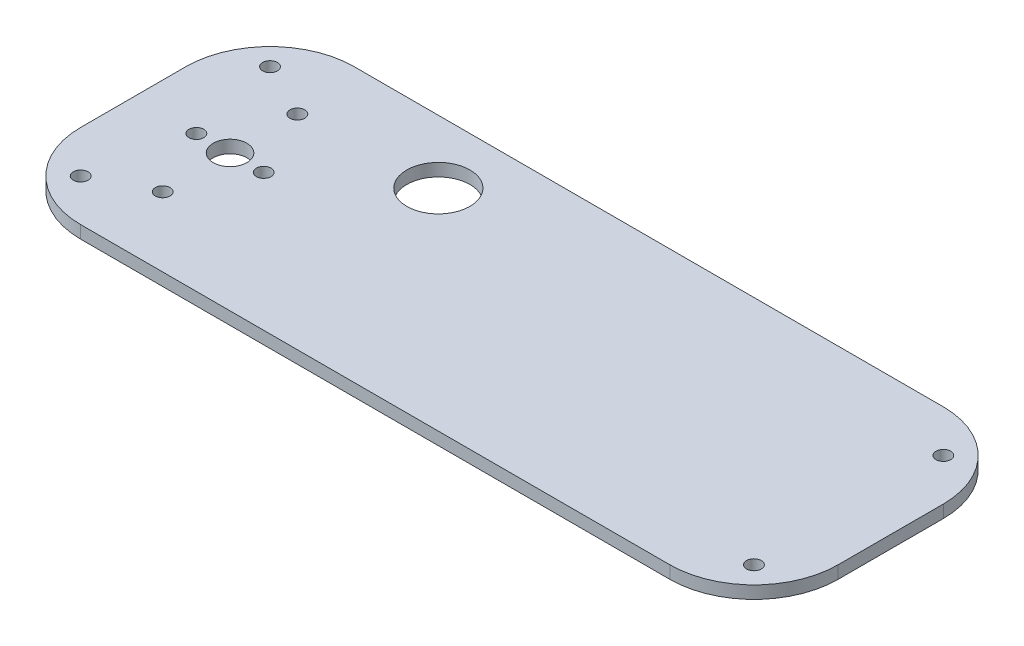
ISO-10303-21;
HEADER;
FILE_DESCRIPTION(('STEP AP214'),'2;1');
FILE_NAME('part.step','',(''),(''),'','','');
FILE_SCHEMA(('AUTOMOTIVE_DESIGN { 1 0 10303 214 1 1 1 1 }'));
ENDSEC;
DATA;
#1=APPLICATION_CONTEXT('core data for automotive mechanical design processes');
#2=APPLICATION_PROTOCOL_DEFINITION('international standard','automotive_design',2000,#1);
#3=PRODUCT_CONTEXT('',#1,'mechanical');
#4=PRODUCT('Part','Part','',(#3));
#5=PRODUCT_RELATED_PRODUCT_CATEGORY('part','',(#4));
#6=PRODUCT_DEFINITION_FORMATION('','',#4);
#7=PRODUCT_DEFINITION_CONTEXT('part definition',#1,'design');
#8=PRODUCT_DEFINITION('design','',#6,#7);
#9=PRODUCT_DEFINITION_SHAPE('','',#8);
#10=(LENGTH_UNIT() NAMED_UNIT(*) SI_UNIT(.MILLI.,.METRE.));
#11=(NAMED_UNIT(*) PLANE_ANGLE_UNIT() SI_UNIT($,.RADIAN.));
#12=(NAMED_UNIT(*) SI_UNIT($,.STERADIAN.) SOLID_ANGLE_UNIT());
#13=UNCERTAINTY_MEASURE_WITH_UNIT(LENGTH_MEASURE(1.E-05),#10,'distance_accuracy_value','');
#14=(GEOMETRIC_REPRESENTATION_CONTEXT(3) GLOBAL_UNCERTAINTY_ASSIGNED_CONTEXT((#13)) GLOBAL_UNIT_ASSIGNED_CONTEXT((#10,
#11,#12)) REPRESENTATION_CONTEXT('',''));
#15=CARTESIAN_POINT('',(0.,0.,0.));
#16=DIRECTION('',(0.,0.,1.));
#17=DIRECTION('',(1.,0.,0.));
#18=AXIS2_PLACEMENT_3D('',#15,#16,#17);
#19=CARTESIAN_POINT('',(90.,3.,32.5));
#20=DIRECTION('',(-1.,0.,0.));
#21=DIRECTION('',(0.,0.,1.));
#22=AXIS2_PLACEMENT_3D('',#19,#20,#21);
#23=PLANE('',#22);
#24=DIRECTION('',(0.,0.,-1.));
#25=VECTOR('',#24,1.);
#26=CARTESIAN_POINT('',(90.,0.,32.5));
#27=LINE('',#26,#25);
#28=CARTESIAN_POINT('',(90.,0.,12.5));
#29=VERTEX_POINT('',#28);
#30=CARTESIAN_POINT('',(90.,0.,-12.5));
#31=VERTEX_POINT('',#30);
#32=EDGE_CURVE('E187',#29,#31,#27,.T.);
#33=ORIENTED_EDGE('',*,*,#32,.T.);
#34=DIRECTION('',(0.,-1.,0.));
#35=VECTOR('',#34,1.);
#36=CARTESIAN_POINT('',(90.,3.,-12.5));
#37=LINE('',#36,#35);
#38=CARTESIAN_POINT('',(90.,3.,-12.5));
#39=VERTEX_POINT('',#38);
#40=EDGE_CURVE('E11',#31,#39,#37,.F.);
#41=ORIENTED_EDGE('',*,*,#40,.T.);
#42=DIRECTION('',(0.,0.,-1.));
#43=VECTOR('',#42,1.);
#44=CARTESIAN_POINT('',(90.,3.,32.5));
#45=LINE('',#44,#43);
#46=CARTESIAN_POINT('',(90.,3.,12.5));
#47=VERTEX_POINT('',#46);
#48=EDGE_CURVE('E140',#47,#39,#45,.T.);
#49=ORIENTED_EDGE('',*,*,#48,.F.);
#50=DIRECTION('',(0.,-1.,0.));
#51=VECTOR('',#50,1.);
#52=CARTESIAN_POINT('',(90.,3.,12.5));
#53=LINE('',#52,#51);
#54=EDGE_CURVE('E53',#47,#29,#53,.T.);
#55=ORIENTED_EDGE('',*,*,#54,.T.);
#56=EDGE_LOOP('',(#33,#41,#49,#55));
#57=FACE_BOUND('',#56,.T.);
#58=ADVANCED_FACE('F44',(#57),#23,.F.);
#59=CARTESIAN_POINT('',(-90.,3.,-32.5));
#60=DIRECTION('',(0.,0.,1.));
#61=DIRECTION('',(1.,0.,0.));
#62=AXIS2_PLACEMENT_3D('',#59,#60,#61);
#63=PLANE('',#62);
#64=DIRECTION('',(-1.,0.,0.));
#65=VECTOR('',#64,1.);
#66=CARTESIAN_POINT('',(-90.,0.,-32.5));
#67=LINE('',#66,#65);
#68=CARTESIAN_POINT('',(69.9999999999999,0.,-32.5));
#69=VERTEX_POINT('',#68);
#70=CARTESIAN_POINT('',(-70.,0.,-32.5));
#71=VERTEX_POINT('',#70);
#72=EDGE_CURVE('E147',#69,#71,#67,.T.);
#73=ORIENTED_EDGE('',*,*,#72,.T.);
#74=DIRECTION('',(0.,-1.,0.));
#75=VECTOR('',#74,1.);
#76=CARTESIAN_POINT('',(-70.,3.,-32.5));
#77=LINE('',#76,#75);
#78=CARTESIAN_POINT('',(-70.,3.,-32.5));
#79=VERTEX_POINT('',#78);
#80=EDGE_CURVE('E60',#71,#79,#77,.F.);
#81=ORIENTED_EDGE('',*,*,#80,.T.);
#82=DIRECTION('',(-1.,0.,0.));
#83=VECTOR('',#82,1.);
#84=CARTESIAN_POINT('',(-90.,3.,-32.5));
#85=LINE('',#84,#83);
#86=CARTESIAN_POINT('',(69.9999999999999,3.,-32.5));
#87=VERTEX_POINT('',#86);
#88=EDGE_CURVE('E145',#87,#79,#85,.T.);
#89=ORIENTED_EDGE('',*,*,#88,.F.);
#90=DIRECTION('',(0.,-1.,0.));
#91=VECTOR('',#90,1.);
#92=CARTESIAN_POINT('',(70.,3.,-32.5));
#93=LINE('',#92,#91);
#94=EDGE_CURVE('E176',#87,#69,#93,.T.);
#95=ORIENTED_EDGE('',*,*,#94,.T.);
#96=EDGE_LOOP('',(#73,#81,#89,#95));
#97=FACE_BOUND('',#96,.T.);
#98=ADVANCED_FACE('F327',(#97),#63,.F.);
#99=CARTESIAN_POINT('',(-90.,3.,32.5));
#100=DIRECTION('',(1.,0.,0.));
#101=DIRECTION('',(0.,0.,-1.));
#102=AXIS2_PLACEMENT_3D('',#99,#100,#101);
#103=PLANE('',#102);
#104=DIRECTION('',(0.,0.,1.));
#105=VECTOR('',#104,1.);
#106=CARTESIAN_POINT('',(-90.,0.,32.5));
#107=LINE('',#106,#105);
#108=CARTESIAN_POINT('',(-90.,0.,-12.5));
#109=VERTEX_POINT('',#108);
#110=CARTESIAN_POINT('',(-90.,0.,12.5));
#111=VERTEX_POINT('',#110);
#112=EDGE_CURVE('E141',#109,#111,#107,.T.);
#113=ORIENTED_EDGE('',*,*,#112,.T.);
#114=DIRECTION('',(0.,-1.,0.));
#115=VECTOR('',#114,1.);
#116=CARTESIAN_POINT('',(-90.,3.,12.5));
#117=LINE('',#116,#115);
#118=CARTESIAN_POINT('',(-90.,3.,12.5));
#119=VERTEX_POINT('',#118);
#120=EDGE_CURVE('E116',#111,#119,#117,.F.);
#121=ORIENTED_EDGE('',*,*,#120,.T.);
#122=DIRECTION('',(0.,0.,1.));
#123=VECTOR('',#122,1.);
#124=CARTESIAN_POINT('',(-90.,3.,32.5));
#125=LINE('',#124,#123);
#126=CARTESIAN_POINT('',(-90.,3.,-12.5));
#127=VERTEX_POINT('',#126);
#128=EDGE_CURVE('E203',#127,#119,#125,.T.);
#129=ORIENTED_EDGE('',*,*,#128,.F.);
#130=DIRECTION('',(0.,-1.,0.));
#131=VECTOR('',#130,1.);
#132=CARTESIAN_POINT('',(-90.,3.,-12.5));
#133=LINE('',#132,#131);
#134=EDGE_CURVE('E122',#127,#109,#133,.T.);
#135=ORIENTED_EDGE('',*,*,#134,.T.);
#136=EDGE_LOOP('',(#113,#121,#129,#135));
#137=FACE_BOUND('',#136,.T.);
#138=ADVANCED_FACE('F324',(#137),#103,.F.);
#139=CARTESIAN_POINT('',(-90.,3.,32.5));
#140=DIRECTION('',(0.,0.,-1.));
#141=DIRECTION('',(-1.,0.,0.));
#142=AXIS2_PLACEMENT_3D('',#139,#140,#141);
#143=PLANE('',#142);
#144=DIRECTION('',(1.,0.,0.));
#145=VECTOR('',#144,1.);
#146=CARTESIAN_POINT('',(-90.,3.,32.5));
#147=LINE('',#146,#145);
#148=CARTESIAN_POINT('',(-70.,3.,32.5));
#149=VERTEX_POINT('',#148);
#150=CARTESIAN_POINT('',(69.9999999999999,3.,32.5));
#151=VERTEX_POINT('',#150);
#152=EDGE_CURVE('E132',#149,#151,#147,.T.);
#153=ORIENTED_EDGE('',*,*,#152,.F.);
#154=DIRECTION('',(0.,-1.,0.));
#155=VECTOR('',#154,1.);
#156=CARTESIAN_POINT('',(-70.,3.,32.5));
#157=LINE('',#156,#155);
#158=CARTESIAN_POINT('',(-70.,0.,32.5));
#159=VERTEX_POINT('',#158);
#160=EDGE_CURVE('E115',#149,#159,#157,.T.);
#161=ORIENTED_EDGE('',*,*,#160,.T.);
#162=DIRECTION('',(1.,0.,0.));
#163=VECTOR('',#162,1.);
#164=CARTESIAN_POINT('',(-90.,0.,32.5));
#165=LINE('',#164,#163);
#166=CARTESIAN_POINT('',(69.9999999999999,0.,32.5));
#167=VERTEX_POINT('',#166);
#168=EDGE_CURVE('E129',#159,#167,#165,.T.);
#169=ORIENTED_EDGE('',*,*,#168,.T.);
#170=DIRECTION('',(0.,-1.,0.));
#171=VECTOR('',#170,1.);
#172=CARTESIAN_POINT('',(70.,3.,32.5));
#173=LINE('',#172,#171);
#174=EDGE_CURVE('E135',#167,#151,#173,.F.);
#175=ORIENTED_EDGE('',*,*,#174,.T.);
#176=EDGE_LOOP('',(#153,#161,#169,#175));
#177=FACE_BOUND('',#176,.T.);
#178=ADVANCED_FACE('F128',(#177),#143,.F.);
#179=CARTESIAN_POINT('',(0.,3.,0.));
#180=DIRECTION('',(0.,-1.,0.));
#181=DIRECTION('',(0.,0.,-1.));
#182=AXIS2_PLACEMENT_3D('',#179,#180,#181);
#183=PLANE('',#182);
#184=CARTESIAN_POINT('',(-35.,3.,-17.5));
#185=DIRECTION('',(0.,-1.,0.));
#186=DIRECTION('',(0.,0.,-1.));
#187=AXIS2_PLACEMENT_3D('',#184,#185,#186);
#188=CIRCLE('',#187,7.5);
#189=CARTESIAN_POINT('',(-35.,3.,-25.));
#190=VERTEX_POINT('',#189);
#191=EDGE_CURVE('E266',#190,#190,#188,.T.);
#192=ORIENTED_EDGE('',*,*,#191,.T.);
#193=EDGE_LOOP('',(#192));
#194=FACE_BOUND('',#193,.T.);
#195=CARTESIAN_POINT('',(-67.,3.,16.));
#196=DIRECTION('',(0.,-1.,0.));
#197=DIRECTION('',(0.,0.,-1.));
#198=AXIS2_PLACEMENT_3D('',#195,#196,#197);
#199=CIRCLE('',#198,1.75);
#200=CARTESIAN_POINT('',(-67.,3.,14.25));
#201=VERTEX_POINT('',#200);
#202=EDGE_CURVE('E241',#201,#201,#199,.T.);
#203=ORIENTED_EDGE('',*,*,#202,.T.);
#204=EDGE_LOOP('',(#203));
#205=FACE_BOUND('',#204,.T.);
#206=CARTESIAN_POINT('',(-67.,3.,-16.));
#207=DIRECTION('',(0.,-1.,0.));
#208=DIRECTION('',(0.,0.,-1.));
#209=AXIS2_PLACEMENT_3D('',#206,#207,#208);
#210=CIRCLE('',#209,1.75);
#211=CARTESIAN_POINT('',(-67.,3.,-17.75));
#212=VERTEX_POINT('',#211);
#213=EDGE_CURVE('E249',#212,#212,#210,.T.);
#214=ORIENTED_EDGE('',*,*,#213,.T.);
#215=EDGE_LOOP('',(#214));
#216=FACE_BOUND('',#215,.T.);
#217=CARTESIAN_POINT('',(-75.,3.,0.));
#218=DIRECTION('',(0.,-1.,0.));
#219=DIRECTION('',(0.,0.,-1.));
#220=AXIS2_PLACEMENT_3D('',#217,#218,#219);
#221=CIRCLE('',#220,1.75);
#222=CARTESIAN_POINT('',(-75.,3.,-1.75));
#223=VERTEX_POINT('',#222);
#224=EDGE_CURVE('E250',#223,#223,#221,.T.);
#225=ORIENTED_EDGE('',*,*,#224,.T.);
#226=EDGE_LOOP('',(#225));
#227=FACE_BOUND('',#226,.T.);
#228=CARTESIAN_POINT('',(-59.,3.,0.));
#229=DIRECTION('',(0.,-1.,0.));
#230=DIRECTION('',(0.,0.,-1.));
#231=AXIS2_PLACEMENT_3D('',#228,#229,#230);
#232=CIRCLE('',#231,1.75);
#233=CARTESIAN_POINT('',(-59.,3.,-1.75));
#234=VERTEX_POINT('',#233);
#235=EDGE_CURVE('E265',#234,#234,#232,.T.);
#236=ORIENTED_EDGE('',*,*,#235,.T.);
#237=EDGE_LOOP('',(#236));
#238=FACE_BOUND('',#237,.T.);
#239=CARTESIAN_POINT('',(-67.,3.,0.));
#240=DIRECTION('',(0.,-1.,0.));
#241=DIRECTION('',(0.,0.,-1.));
#242=AXIS2_PLACEMENT_3D('',#239,#240,#241);
#243=CIRCLE('',#242,4.00000000000001);
#244=CARTESIAN_POINT('',(-67.,3.,-4.00000000000001));
#245=VERTEX_POINT('',#244);
#246=EDGE_CURVE('E218',#245,#245,#243,.T.);
#247=ORIENTED_EDGE('',*,*,#246,.T.);
#248=EDGE_LOOP('',(#247));
#249=FACE_BOUND('',#248,.T.);
#250=CARTESIAN_POINT('',(80.,3.,-22.5));
#251=DIRECTION('',(0.,1.,0.));
#252=DIRECTION('',(0.,0.,1.));
#253=AXIS2_PLACEMENT_3D('',#250,#251,#252);
#254=CIRCLE('',#253,1.75);
#255=CARTESIAN_POINT('',(80.,3.,-20.75));
#256=VERTEX_POINT('',#255);
#257=EDGE_CURVE('E217',#256,#256,#254,.T.);
#258=ORIENTED_EDGE('',*,*,#257,.F.);
#259=EDGE_LOOP('',(#258));
#260=FACE_BOUND('',#259,.T.);
#261=CARTESIAN_POINT('',(80.,3.,22.5));
#262=DIRECTION('',(0.,1.,0.));
#263=DIRECTION('',(0.,0.,1.));
#264=AXIS2_PLACEMENT_3D('',#261,#262,#263);
#265=CIRCLE('',#264,1.75);
#266=CARTESIAN_POINT('',(80.,3.,24.25));
#267=VERTEX_POINT('',#266);
#268=EDGE_CURVE('E226',#267,#267,#265,.T.);
#269=ORIENTED_EDGE('',*,*,#268,.F.);
#270=EDGE_LOOP('',(#269));
#271=FACE_BOUND('',#270,.T.);
#272=CARTESIAN_POINT('',(-80.,3.,22.5));
#273=DIRECTION('',(0.,1.,0.));
#274=DIRECTION('',(0.,0.,1.));
#275=AXIS2_PLACEMENT_3D('',#272,#273,#274);
#276=CIRCLE('',#275,1.75);
#277=CARTESIAN_POINT('',(-80.,3.,24.25));
#278=VERTEX_POINT('',#277);
#279=EDGE_CURVE('E211',#278,#278,#276,.T.);
#280=ORIENTED_EDGE('',*,*,#279,.F.);
#281=EDGE_LOOP('',(#280));
#282=FACE_BOUND('',#281,.T.);
#283=CARTESIAN_POINT('',(-80.,3.,-22.5));
#284=DIRECTION('',(0.,1.,0.));
#285=DIRECTION('',(0.,0.,1.));
#286=AXIS2_PLACEMENT_3D('',#283,#284,#285);
#287=CIRCLE('',#286,1.75);
#288=CARTESIAN_POINT('',(-80.,3.,-20.75));
#289=VERTEX_POINT('',#288);
#290=EDGE_CURVE('E198',#289,#289,#287,.T.);
#291=ORIENTED_EDGE('',*,*,#290,.F.);
#292=EDGE_LOOP('',(#291));
#293=FACE_BOUND('',#292,.T.);
#294=ORIENTED_EDGE('',*,*,#128,.T.);
#295=CARTESIAN_POINT('',(-70.,3.,12.5));
#296=DIRECTION('',(0.,-1.,0.));
#297=DIRECTION('',(0.,0.,-1.));
#298=AXIS2_PLACEMENT_3D('',#295,#296,#297);
#299=CIRCLE('',#298,20.);
#300=EDGE_CURVE('E173',#119,#149,#299,.F.);
#301=ORIENTED_EDGE('',*,*,#300,.T.);
#302=ORIENTED_EDGE('',*,*,#152,.T.);
#303=CARTESIAN_POINT('',(70.,3.,12.5));
#304=DIRECTION('',(0.,-1.,0.));
#305=DIRECTION('',(0.,0.,-1.));
#306=AXIS2_PLACEMENT_3D('',#303,#304,#305);
#307=CIRCLE('',#306,20.);
#308=EDGE_CURVE('E165',#151,#47,#307,.F.);
#309=ORIENTED_EDGE('',*,*,#308,.T.);
#310=ORIENTED_EDGE('',*,*,#48,.T.);
#311=CARTESIAN_POINT('',(70.,3.,-12.5));
#312=DIRECTION('',(0.,-1.,0.));
#313=DIRECTION('',(0.,0.,-1.));
#314=AXIS2_PLACEMENT_3D('',#311,#312,#313);
#315=CIRCLE('',#314,20.);
#316=EDGE_CURVE('E67',#39,#87,#315,.F.);
#317=ORIENTED_EDGE('',*,*,#316,.T.);
#318=ORIENTED_EDGE('',*,*,#88,.T.);
#319=CARTESIAN_POINT('',(-70.,3.,-12.5));
#320=DIRECTION('',(0.,-1.,0.));
#321=DIRECTION('',(0.,0.,-1.));
#322=AXIS2_PLACEMENT_3D('',#319,#320,#321);
#323=CIRCLE('',#322,20.);
#324=EDGE_CURVE('E170',#79,#127,#323,.F.);
#325=ORIENTED_EDGE('',*,*,#324,.T.);
#326=EDGE_LOOP('',(#294,#301,#302,#309,#310,#317,#318,#325));
#327=FACE_BOUND('',#326,.T.);
#328=ADVANCED_FACE('F290',(#194,#205,#216,#227,#238,#249,#260,#271,#282,#293,#327),#183,.F.);
#329=CARTESIAN_POINT('',(0.,0.,0.));
#330=DIRECTION('',(0.,-1.,0.));
#331=DIRECTION('',(0.,0.,-1.));
#332=AXIS2_PLACEMENT_3D('',#329,#330,#331);
#333=PLANE('',#332);
#334=CARTESIAN_POINT('',(-35.,0.,-17.5));
#335=DIRECTION('',(0.,-1.,0.));
#336=DIRECTION('',(0.,0.,-1.));
#337=AXIS2_PLACEMENT_3D('',#334,#335,#336);
#338=CIRCLE('',#337,7.5);
#339=CARTESIAN_POINT('',(-35.,0.,-25.));
#340=VERTEX_POINT('',#339);
#341=EDGE_CURVE('E280',#340,#340,#338,.T.);
#342=ORIENTED_EDGE('',*,*,#341,.F.);
#343=EDGE_LOOP('',(#342));
#344=FACE_BOUND('',#343,.T.);
#345=CARTESIAN_POINT('',(-67.,0.,16.));
#346=DIRECTION('',(0.,-1.,0.));
#347=DIRECTION('',(0.,0.,-1.));
#348=AXIS2_PLACEMENT_3D('',#345,#346,#347);
#349=CIRCLE('',#348,1.75);
#350=CARTESIAN_POINT('',(-67.,0.,14.25));
#351=VERTEX_POINT('',#350);
#352=EDGE_CURVE('E254',#351,#351,#349,.T.);
#353=ORIENTED_EDGE('',*,*,#352,.F.);
#354=EDGE_LOOP('',(#353));
#355=FACE_BOUND('',#354,.T.);
#356=CARTESIAN_POINT('',(-67.,0.,-16.));
#357=DIRECTION('',(0.,-1.,0.));
#358=DIRECTION('',(0.,0.,-1.));
#359=AXIS2_PLACEMENT_3D('',#356,#357,#358);
#360=CIRCLE('',#359,1.75);
#361=CARTESIAN_POINT('',(-67.,0.,-17.75));
#362=VERTEX_POINT('',#361);
#363=EDGE_CURVE('E245',#362,#362,#360,.T.);
#364=ORIENTED_EDGE('',*,*,#363,.F.);
#365=EDGE_LOOP('',(#364));
#366=FACE_BOUND('',#365,.T.);
#367=CARTESIAN_POINT('',(-75.,0.,0.));
#368=DIRECTION('',(0.,-1.,0.));
#369=DIRECTION('',(0.,0.,-1.));
#370=AXIS2_PLACEMENT_3D('',#367,#368,#369);
#371=CIRCLE('',#370,1.75);
#372=CARTESIAN_POINT('',(-75.,0.,-1.75));
#373=VERTEX_POINT('',#372);
#374=EDGE_CURVE('E270',#373,#373,#371,.T.);
#375=ORIENTED_EDGE('',*,*,#374,.F.);
#376=EDGE_LOOP('',(#375));
#377=FACE_BOUND('',#376,.T.);
#378=CARTESIAN_POINT('',(-59.,0.,0.));
#379=DIRECTION('',(0.,-1.,0.));
#380=DIRECTION('',(0.,0.,-1.));
#381=AXIS2_PLACEMENT_3D('',#378,#379,#380);
#382=CIRCLE('',#381,1.75);
#383=CARTESIAN_POINT('',(-59.,0.,-1.75));
#384=VERTEX_POINT('',#383);
#385=EDGE_CURVE('E261',#384,#384,#382,.T.);
#386=ORIENTED_EDGE('',*,*,#385,.F.);
#387=EDGE_LOOP('',(#386));
#388=FACE_BOUND('',#387,.T.);
#389=CARTESIAN_POINT('',(-67.,0.,0.));
#390=DIRECTION('',(0.,-1.,0.));
#391=DIRECTION('',(0.,0.,-1.));
#392=AXIS2_PLACEMENT_3D('',#389,#390,#391);
#393=CIRCLE('',#392,4.00000000000001);
#394=CARTESIAN_POINT('',(-67.,0.,-4.00000000000001));
#395=VERTEX_POINT('',#394);
#396=EDGE_CURVE('E237',#395,#395,#393,.T.);
#397=ORIENTED_EDGE('',*,*,#396,.F.);
#398=EDGE_LOOP('',(#397));
#399=FACE_BOUND('',#398,.T.);
#400=CARTESIAN_POINT('',(80.,0.,-22.5));
#401=DIRECTION('',(0.,1.,0.));
#402=DIRECTION('',(0.,0.,1.));
#403=AXIS2_PLACEMENT_3D('',#400,#401,#402);
#404=CIRCLE('',#403,1.75);
#405=CARTESIAN_POINT('',(80.,0.,-20.75));
#406=VERTEX_POINT('',#405);
#407=EDGE_CURVE('E213',#406,#406,#404,.T.);
#408=ORIENTED_EDGE('',*,*,#407,.T.);
#409=EDGE_LOOP('',(#408));
#410=FACE_BOUND('',#409,.T.);
#411=CARTESIAN_POINT('',(80.,0.,22.5));
#412=DIRECTION('',(0.,1.,0.));
#413=DIRECTION('',(0.,0.,1.));
#414=AXIS2_PLACEMENT_3D('',#411,#412,#413);
#415=CIRCLE('',#414,1.75);
#416=CARTESIAN_POINT('',(80.,0.,24.25));
#417=VERTEX_POINT('',#416);
#418=EDGE_CURVE('E222',#417,#417,#415,.T.);
#419=ORIENTED_EDGE('',*,*,#418,.T.);
#420=EDGE_LOOP('',(#419));
#421=FACE_BOUND('',#420,.T.);
#422=CARTESIAN_POINT('',(-80.,0.,22.5));
#423=DIRECTION('',(0.,1.,0.));
#424=DIRECTION('',(0.,0.,1.));
#425=AXIS2_PLACEMENT_3D('',#422,#423,#424);
#426=CIRCLE('',#425,1.75);
#427=CARTESIAN_POINT('',(-80.,0.,24.25));
#428=VERTEX_POINT('',#427);
#429=EDGE_CURVE('E230',#428,#428,#426,.T.);
#430=ORIENTED_EDGE('',*,*,#429,.T.);
#431=EDGE_LOOP('',(#430));
#432=FACE_BOUND('',#431,.T.);
#433=CARTESIAN_POINT('',(-80.,0.,-22.5));
#434=DIRECTION('',(0.,1.,0.));
#435=DIRECTION('',(0.,0.,1.));
#436=AXIS2_PLACEMENT_3D('',#433,#434,#435);
#437=CIRCLE('',#436,1.75);
#438=CARTESIAN_POINT('',(-80.,0.,-20.75));
#439=VERTEX_POINT('',#438);
#440=EDGE_CURVE('E193',#439,#439,#437,.T.);
#441=ORIENTED_EDGE('',*,*,#440,.T.);
#442=EDGE_LOOP('',(#441));
#443=FACE_BOUND('',#442,.T.);
#444=ORIENTED_EDGE('',*,*,#168,.F.);
#445=CARTESIAN_POINT('',(-70.,0.,12.5));
#446=DIRECTION('',(0.,-1.,0.));
#447=DIRECTION('',(0.,0.,-1.));
#448=AXIS2_PLACEMENT_3D('',#445,#446,#447);
#449=CIRCLE('',#448,20.);
#450=EDGE_CURVE('E111',#159,#111,#449,.T.);
#451=ORIENTED_EDGE('',*,*,#450,.T.);
#452=ORIENTED_EDGE('',*,*,#112,.F.);
#453=CARTESIAN_POINT('',(-70.,0.,-12.5));
#454=DIRECTION('',(0.,-1.,0.));
#455=DIRECTION('',(0.,0.,-1.));
#456=AXIS2_PLACEMENT_3D('',#453,#454,#455);
#457=CIRCLE('',#456,20.);
#458=EDGE_CURVE('E123',#109,#71,#457,.T.);
#459=ORIENTED_EDGE('',*,*,#458,.T.);
#460=ORIENTED_EDGE('',*,*,#72,.F.);
#461=CARTESIAN_POINT('',(70.,0.,-12.5));
#462=DIRECTION('',(0.,-1.,0.));
#463=DIRECTION('',(0.,0.,-1.));
#464=AXIS2_PLACEMENT_3D('',#461,#462,#463);
#465=CIRCLE('',#464,20.);
#466=EDGE_CURVE('E155',#69,#31,#465,.T.);
#467=ORIENTED_EDGE('',*,*,#466,.T.);
#468=ORIENTED_EDGE('',*,*,#32,.F.);
#469=CARTESIAN_POINT('',(70.,0.,12.5));
#470=DIRECTION('',(0.,-1.,0.));
#471=DIRECTION('',(0.,0.,-1.));
#472=AXIS2_PLACEMENT_3D('',#469,#470,#471);
#473=CIRCLE('',#472,20.);
#474=EDGE_CURVE('E134',#29,#167,#473,.T.);
#475=ORIENTED_EDGE('',*,*,#474,.T.);
#476=EDGE_LOOP('',(#444,#451,#452,#459,#460,#467,#468,#475));
#477=FACE_BOUND('',#476,.T.);
#478=ADVANCED_FACE('F137',(#344,#355,#366,#377,#388,#399,#410,#421,#432,#443,#477),#333,.T.);
#479=CARTESIAN_POINT('',(-70.,3.,12.5));
#480=DIRECTION('',(0.,-1.,0.));
#481=DIRECTION('',(0.,0.,-1.));
#482=AXIS2_PLACEMENT_3D('',#479,#480,#481);
#483=CYLINDRICAL_SURFACE('',#482,20.);
#484=ORIENTED_EDGE('',*,*,#300,.F.);
#485=ORIENTED_EDGE('',*,*,#120,.F.);
#486=ORIENTED_EDGE('',*,*,#450,.F.);
#487=ORIENTED_EDGE('',*,*,#160,.F.);
#488=EDGE_LOOP('',(#484,#485,#486,#487));
#489=FACE_BOUND('',#488,.T.);
#490=ADVANCED_FACE('F114',(#489),#483,.T.);
#491=CARTESIAN_POINT('',(-70.,3.,-12.5));
#492=DIRECTION('',(0.,-1.,0.));
#493=DIRECTION('',(0.,0.,-1.));
#494=AXIS2_PLACEMENT_3D('',#491,#492,#493);
#495=CYLINDRICAL_SURFACE('',#494,20.);
#496=ORIENTED_EDGE('',*,*,#324,.F.);
#497=ORIENTED_EDGE('',*,*,#80,.F.);
#498=ORIENTED_EDGE('',*,*,#458,.F.);
#499=ORIENTED_EDGE('',*,*,#134,.F.);
#500=EDGE_LOOP('',(#496,#497,#498,#499));
#501=FACE_BOUND('',#500,.T.);
#502=ADVANCED_FACE('F326',(#501),#495,.T.);
#503=CARTESIAN_POINT('',(70.,3.,-12.5));
#504=DIRECTION('',(0.,-1.,0.));
#505=DIRECTION('',(0.,0.,-1.));
#506=AXIS2_PLACEMENT_3D('',#503,#504,#505);
#507=CYLINDRICAL_SURFACE('',#506,20.);
#508=ORIENTED_EDGE('',*,*,#316,.F.);
#509=ORIENTED_EDGE('',*,*,#40,.F.);
#510=ORIENTED_EDGE('',*,*,#466,.F.);
#511=ORIENTED_EDGE('',*,*,#94,.F.);
#512=EDGE_LOOP('',(#508,#509,#510,#511));
#513=FACE_BOUND('',#512,.T.);
#514=ADVANCED_FACE('F330',(#513),#507,.T.);
#515=CARTESIAN_POINT('',(70.,3.,12.5));
#516=DIRECTION('',(0.,-1.,0.));
#517=DIRECTION('',(0.,0.,-1.));
#518=AXIS2_PLACEMENT_3D('',#515,#516,#517);
#519=CYLINDRICAL_SURFACE('',#518,20.);
#520=ORIENTED_EDGE('',*,*,#308,.F.);
#521=ORIENTED_EDGE('',*,*,#174,.F.);
#522=ORIENTED_EDGE('',*,*,#474,.F.);
#523=ORIENTED_EDGE('',*,*,#54,.F.);
#524=EDGE_LOOP('',(#520,#521,#522,#523));
#525=FACE_BOUND('',#524,.T.);
#526=ADVANCED_FACE('F46',(#525),#519,.T.);
#527=CARTESIAN_POINT('',(-80.,0.,-22.5));
#528=DIRECTION('',(0.,1.,0.));
#529=DIRECTION('',(0.,0.,1.));
#530=AXIS2_PLACEMENT_3D('',#527,#528,#529);
#531=CYLINDRICAL_SURFACE('',#530,1.75);
#532=ORIENTED_EDGE('',*,*,#440,.F.);
#533=EDGE_LOOP('',(#532));
#534=FACE_BOUND('',#533,.T.);
#535=ORIENTED_EDGE('',*,*,#290,.T.);
#536=EDGE_LOOP('',(#535));
#537=FACE_BOUND('',#536,.T.);
#538=ADVANCED_FACE('F310',(#534,#537),#531,.F.);
#539=CARTESIAN_POINT('',(-80.,0.,22.5));
#540=DIRECTION('',(0.,1.,0.));
#541=DIRECTION('',(0.,0.,1.));
#542=AXIS2_PLACEMENT_3D('',#539,#540,#541);
#543=CYLINDRICAL_SURFACE('',#542,1.75);
#544=ORIENTED_EDGE('',*,*,#429,.F.);
#545=EDGE_LOOP('',(#544));
#546=FACE_BOUND('',#545,.T.);
#547=ORIENTED_EDGE('',*,*,#279,.T.);
#548=EDGE_LOOP('',(#547));
#549=FACE_BOUND('',#548,.T.);
#550=ADVANCED_FACE('F313',(#546,#549),#543,.F.);
#551=CARTESIAN_POINT('',(80.,0.,22.5));
#552=DIRECTION('',(0.,1.,0.));
#553=DIRECTION('',(0.,0.,1.));
#554=AXIS2_PLACEMENT_3D('',#551,#552,#553);
#555=CYLINDRICAL_SURFACE('',#554,1.75);
#556=ORIENTED_EDGE('',*,*,#418,.F.);
#557=EDGE_LOOP('',(#556));
#558=FACE_BOUND('',#557,.T.);
#559=ORIENTED_EDGE('',*,*,#268,.T.);
#560=EDGE_LOOP('',(#559));
#561=FACE_BOUND('',#560,.T.);
#562=ADVANCED_FACE('F376',(#558,#561),#555,.F.);
#563=CARTESIAN_POINT('',(80.,0.,-22.5));
#564=DIRECTION('',(0.,1.,0.));
#565=DIRECTION('',(0.,0.,1.));
#566=AXIS2_PLACEMENT_3D('',#563,#564,#565);
#567=CYLINDRICAL_SURFACE('',#566,1.75);
#568=ORIENTED_EDGE('',*,*,#407,.F.);
#569=EDGE_LOOP('',(#568));
#570=FACE_BOUND('',#569,.T.);
#571=ORIENTED_EDGE('',*,*,#257,.T.);
#572=EDGE_LOOP('',(#571));
#573=FACE_BOUND('',#572,.T.);
#574=ADVANCED_FACE('F386',(#570,#573),#567,.F.);
#575=CARTESIAN_POINT('',(-67.,3.,0.));
#576=DIRECTION('',(0.,-1.,0.));
#577=DIRECTION('',(0.,0.,-1.));
#578=AXIS2_PLACEMENT_3D('',#575,#576,#577);
#579=CYLINDRICAL_SURFACE('',#578,4.00000000000001);
#580=ORIENTED_EDGE('',*,*,#246,.F.);
#581=EDGE_LOOP('',(#580));
#582=FACE_BOUND('',#581,.T.);
#583=ORIENTED_EDGE('',*,*,#396,.T.);
#584=EDGE_LOOP('',(#583));
#585=FACE_BOUND('',#584,.T.);
#586=ADVANCED_FACE('F396',(#582,#585),#579,.F.);
#587=CARTESIAN_POINT('',(-59.,3.,0.));
#588=DIRECTION('',(0.,-1.,0.));
#589=DIRECTION('',(0.,0.,-1.));
#590=AXIS2_PLACEMENT_3D('',#587,#588,#589);
#591=CYLINDRICAL_SURFACE('',#590,1.75);
#592=ORIENTED_EDGE('',*,*,#235,.F.);
#593=EDGE_LOOP('',(#592));
#594=FACE_BOUND('',#593,.T.);
#595=ORIENTED_EDGE('',*,*,#385,.T.);
#596=EDGE_LOOP('',(#595));
#597=FACE_BOUND('',#596,.T.);
#598=ADVANCED_FACE('F406',(#594,#597),#591,.F.);
#599=CARTESIAN_POINT('',(-75.,3.,0.));
#600=DIRECTION('',(0.,-1.,0.));
#601=DIRECTION('',(0.,0.,-1.));
#602=AXIS2_PLACEMENT_3D('',#599,#600,#601);
#603=CYLINDRICAL_SURFACE('',#602,1.75);
#604=ORIENTED_EDGE('',*,*,#224,.F.);
#605=EDGE_LOOP('',(#604));
#606=FACE_BOUND('',#605,.T.);
#607=ORIENTED_EDGE('',*,*,#374,.T.);
#608=EDGE_LOOP('',(#607));
#609=FACE_BOUND('',#608,.T.);
#610=ADVANCED_FACE('F416',(#606,#609),#603,.F.);
#611=CARTESIAN_POINT('',(-67.,3.,-16.));
#612=DIRECTION('',(0.,-1.,0.));
#613=DIRECTION('',(0.,0.,-1.));
#614=AXIS2_PLACEMENT_3D('',#611,#612,#613);
#615=CYLINDRICAL_SURFACE('',#614,1.75);
#616=ORIENTED_EDGE('',*,*,#213,.F.);
#617=EDGE_LOOP('',(#616));
#618=FACE_BOUND('',#617,.T.);
#619=ORIENTED_EDGE('',*,*,#363,.T.);
#620=EDGE_LOOP('',(#619));
#621=FACE_BOUND('',#620,.T.);
#622=ADVANCED_FACE('F426',(#618,#621),#615,.F.);
#623=CARTESIAN_POINT('',(-67.,3.,16.));
#624=DIRECTION('',(0.,-1.,0.));
#625=DIRECTION('',(0.,0.,-1.));
#626=AXIS2_PLACEMENT_3D('',#623,#624,#625);
#627=CYLINDRICAL_SURFACE('',#626,1.75);
#628=ORIENTED_EDGE('',*,*,#202,.F.);
#629=EDGE_LOOP('',(#628));
#630=FACE_BOUND('',#629,.T.);
#631=ORIENTED_EDGE('',*,*,#352,.T.);
#632=EDGE_LOOP('',(#631));
#633=FACE_BOUND('',#632,.T.);
#634=ADVANCED_FACE('F436',(#630,#633),#627,.F.);
#635=CARTESIAN_POINT('',(-35.,200.,-17.5));
#636=DIRECTION('',(0.,-1.,0.));
#637=DIRECTION('',(0.,0.,-1.));
#638=AXIS2_PLACEMENT_3D('',#635,#636,#637);
#639=CYLINDRICAL_SURFACE('',#638,7.5);
#640=ORIENTED_EDGE('',*,*,#341,.T.);
#641=EDGE_LOOP('',(#640));
#642=FACE_BOUND('',#641,.T.);
#643=ORIENTED_EDGE('',*,*,#191,.F.);
#644=EDGE_LOOP('',(#643));
#645=FACE_BOUND('',#644,.T.);
#646=ADVANCED_FACE('F285',(#642,#645),#639,.F.);
#647=CLOSED_SHELL('',(#58,#98,#138,#178,#328,#478,#490,#502,#514,#526,#538,#550,#562,#574,#586,
#598,#610,#622,#634,#646));
#648=MANIFOLD_SOLID_BREP('B2',#647);
#649=ADVANCED_BREP_SHAPE_REPRESENTATION('',(#18,#648),#14);
#650=SHAPE_DEFINITION_REPRESENTATION(#9,#649);
ENDSEC;
END-ISO-10303-21;
